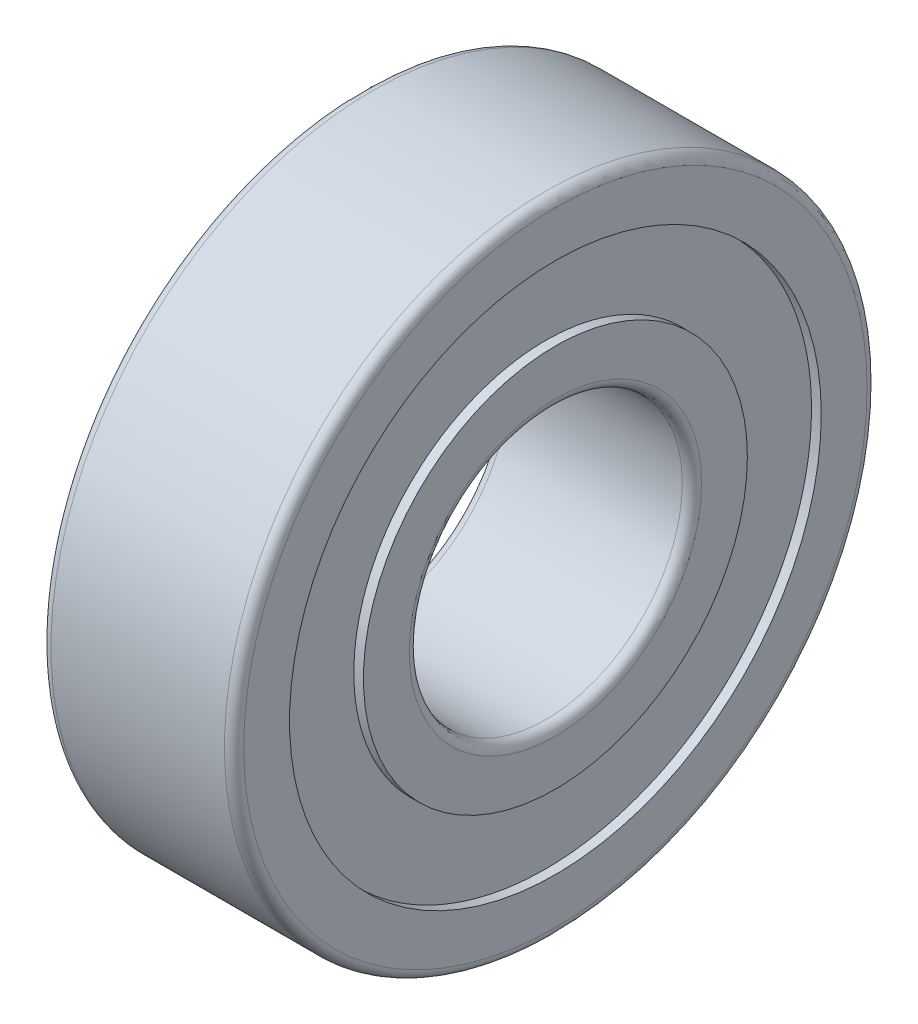
ISO-10303-21;
HEADER;
FILE_DESCRIPTION(('STEP AP214'),'2;1');
FILE_NAME('part.step','',(''),(''),'','','');
FILE_SCHEMA(('AUTOMOTIVE_DESIGN { 1 0 10303 214 1 1 1 1 }'));
ENDSEC;
DATA;
#1=APPLICATION_CONTEXT('core data for automotive mechanical design processes');
#2=APPLICATION_PROTOCOL_DEFINITION('international standard','automotive_design',2000,#1);
#3=PRODUCT_CONTEXT('',#1,'mechanical');
#4=PRODUCT('Part','Part','',(#3));
#5=PRODUCT_RELATED_PRODUCT_CATEGORY('part','',(#4));
#6=PRODUCT_DEFINITION_FORMATION('','',#4);
#7=PRODUCT_DEFINITION_CONTEXT('part definition',#1,'design');
#8=PRODUCT_DEFINITION('design','',#6,#7);
#9=PRODUCT_DEFINITION_SHAPE('','',#8);
#10=(LENGTH_UNIT() NAMED_UNIT(*) SI_UNIT(.MILLI.,.METRE.));
#11=(NAMED_UNIT(*) PLANE_ANGLE_UNIT() SI_UNIT($,.RADIAN.));
#12=(NAMED_UNIT(*) SI_UNIT($,.STERADIAN.) SOLID_ANGLE_UNIT());
#13=UNCERTAINTY_MEASURE_WITH_UNIT(LENGTH_MEASURE(1.E-05),#10,'distance_accuracy_value','');
#14=(GEOMETRIC_REPRESENTATION_CONTEXT(3) GLOBAL_UNCERTAINTY_ASSIGNED_CONTEXT((#13)) GLOBAL_UNIT_ASSIGNED_CONTEXT((#10,
#11,#12)) REPRESENTATION_CONTEXT('',''));
#15=CARTESIAN_POINT('',(0.,0.,0.));
#16=DIRECTION('',(0.,0.,1.));
#17=DIRECTION('',(1.,0.,0.));
#18=AXIS2_PLACEMENT_3D('',#15,#16,#17);
#19=CARTESIAN_POINT('',(-5.40000000000002,16.55,0.));
#20=DIRECTION('',(1.,0.,0.));
#21=DIRECTION('',(0.,0.,-1.));
#22=AXIS2_PLACEMENT_3D('',#19,#20,#21);
#23=PLANE('',#22);
#24=CARTESIAN_POINT('',(-5.40000000000002,0.,0.));
#25=DIRECTION('',(-1.,0.,0.));
#26=DIRECTION('',(0.,0.,1.));
#27=AXIS2_PLACEMENT_3D('',#24,#25,#26);
#28=CIRCLE('',#27,11.95);
#29=CARTESIAN_POINT('',(-5.40000000000002,0.,11.95));
#30=VERTEX_POINT('',#29);
#31=EDGE_CURVE('E55',#30,#30,#28,.T.);
#32=ORIENTED_EDGE('',*,*,#31,.F.);
#33=EDGE_LOOP('',(#32));
#34=FACE_BOUND('',#33,.T.);
#35=CARTESIAN_POINT('',(-5.40000000000002,0.,0.));
#36=DIRECTION('',(-1.,0.,0.));
#37=DIRECTION('',(0.,0.,1.));
#38=AXIS2_PLACEMENT_3D('',#35,#36,#37);
#39=CIRCLE('',#38,16.55);
#40=CARTESIAN_POINT('',(-5.40000000000002,0.,16.55));
#41=VERTEX_POINT('',#40);
#42=EDGE_CURVE('E11',#41,#41,#39,.T.);
#43=ORIENTED_EDGE('',*,*,#42,.T.);
#44=EDGE_LOOP('',(#43));
#45=FACE_BOUND('',#44,.T.);
#46=ADVANCED_FACE('F41',(#34,#45),#23,.F.);
#47=CARTESIAN_POINT('',(-20.6375,0.,0.));
#48=DIRECTION('',(-1.,0.,0.));
#49=DIRECTION('',(0.,0.,1.));
#50=AXIS2_PLACEMENT_3D('',#47,#48,#49);
#51=CYLINDRICAL_SURFACE('',#50,16.55);
#52=CARTESIAN_POINT('',(-4.8,0.,0.));
#53=DIRECTION('',(-1.,0.,0.));
#54=DIRECTION('',(0.,0.,1.));
#55=AXIS2_PLACEMENT_3D('',#52,#53,#54);
#56=CIRCLE('',#55,16.55);
#57=CARTESIAN_POINT('',(-4.8,0.,16.55));
#58=VERTEX_POINT('',#57);
#59=EDGE_CURVE('E47',#58,#58,#56,.T.);
#60=ORIENTED_EDGE('',*,*,#59,.T.);
#61=EDGE_LOOP('',(#60));
#62=FACE_BOUND('',#61,.T.);
#63=ORIENTED_EDGE('',*,*,#42,.F.);
#64=EDGE_LOOP('',(#63));
#65=FACE_BOUND('',#64,.T.);
#66=ADVANCED_FACE('F65',(#62,#65),#51,.T.);
#67=CARTESIAN_POINT('',(-4.8,16.55,0.));
#68=DIRECTION('',(1.,0.,0.));
#69=DIRECTION('',(0.,0.,-1.));
#70=AXIS2_PLACEMENT_3D('',#67,#68,#69);
#71=PLANE('',#70);
#72=CARTESIAN_POINT('',(-4.8,0.,0.));
#73=DIRECTION('',(-1.,0.,0.));
#74=DIRECTION('',(0.,0.,1.));
#75=AXIS2_PLACEMENT_3D('',#72,#73,#74);
#76=CIRCLE('',#75,11.95);
#77=CARTESIAN_POINT('',(-4.8,0.,11.95));
#78=VERTEX_POINT('',#77);
#79=EDGE_CURVE('E51',#78,#78,#76,.T.);
#80=ORIENTED_EDGE('',*,*,#79,.T.);
#81=EDGE_LOOP('',(#80));
#82=FACE_BOUND('',#81,.T.);
#83=ORIENTED_EDGE('',*,*,#59,.F.);
#84=EDGE_LOOP('',(#83));
#85=FACE_BOUND('',#84,.T.);
#86=ADVANCED_FACE('F69',(#82,#85),#71,.T.);
#87=CARTESIAN_POINT('',(-20.6375,0.,0.));
#88=DIRECTION('',(-1.,0.,0.));
#89=DIRECTION('',(0.,0.,1.));
#90=AXIS2_PLACEMENT_3D('',#87,#88,#89);
#91=CYLINDRICAL_SURFACE('',#90,11.95);
#92=ORIENTED_EDGE('',*,*,#31,.T.);
#93=EDGE_LOOP('',(#92));
#94=FACE_BOUND('',#93,.T.);
#95=ORIENTED_EDGE('',*,*,#79,.F.);
#96=EDGE_LOOP('',(#95));
#97=FACE_BOUND('',#96,.T.);
#98=ADVANCED_FACE('F61',(#94,#97),#91,.F.);
#99=CLOSED_SHELL('',(#46,#66,#86,#98));
#100=MANIFOLD_SOLID_BREP('B2',#99);
#101=CARTESIAN_POINT('',(4.8,16.55,0.));
#102=DIRECTION('',(1.,0.,0.));
#103=DIRECTION('',(0.,0.,-1.));
#104=AXIS2_PLACEMENT_3D('',#101,#102,#103);
#105=PLANE('',#104);
#106=CARTESIAN_POINT('',(4.8,0.,0.));
#107=DIRECTION('',(-1.,0.,0.));
#108=DIRECTION('',(0.,0.,1.));
#109=AXIS2_PLACEMENT_3D('',#106,#107,#108);
#110=CIRCLE('',#109,11.95);
#111=CARTESIAN_POINT('',(4.8,0.,11.95));
#112=VERTEX_POINT('',#111);
#113=EDGE_CURVE('E40',#112,#112,#110,.T.);
#114=ORIENTED_EDGE('',*,*,#113,.F.);
#115=EDGE_LOOP('',(#114));
#116=FACE_BOUND('',#115,.T.);
#117=CARTESIAN_POINT('',(4.8,0.,0.));
#118=DIRECTION('',(-1.,0.,0.));
#119=DIRECTION('',(0.,0.,1.));
#120=AXIS2_PLACEMENT_3D('',#117,#118,#119);
#121=CIRCLE('',#120,16.55);
#122=CARTESIAN_POINT('',(4.8,0.,16.55));
#123=VERTEX_POINT('',#122);
#124=EDGE_CURVE('E122',#123,#123,#121,.T.);
#125=ORIENTED_EDGE('',*,*,#124,.T.);
#126=EDGE_LOOP('',(#125));
#127=FACE_BOUND('',#126,.T.);
#128=ADVANCED_FACE('F108',(#116,#127),#105,.F.);
#129=CARTESIAN_POINT('',(-20.6375,0.,0.));
#130=DIRECTION('',(-1.,0.,0.));
#131=DIRECTION('',(0.,0.,1.));
#132=AXIS2_PLACEMENT_3D('',#129,#130,#131);
#133=CYLINDRICAL_SURFACE('',#132,11.95);
#134=ORIENTED_EDGE('',*,*,#113,.T.);
#135=EDGE_LOOP('',(#134));
#136=FACE_BOUND('',#135,.T.);
#137=CARTESIAN_POINT('',(5.40000000000002,0.,0.));
#138=DIRECTION('',(-1.,0.,0.));
#139=DIRECTION('',(0.,0.,1.));
#140=AXIS2_PLACEMENT_3D('',#137,#138,#139);
#141=CIRCLE('',#140,11.95);
#142=CARTESIAN_POINT('',(5.40000000000002,0.,11.95));
#143=VERTEX_POINT('',#142);
#144=EDGE_CURVE('E114',#143,#143,#141,.T.);
#145=ORIENTED_EDGE('',*,*,#144,.F.);
#146=EDGE_LOOP('',(#145));
#147=FACE_BOUND('',#146,.T.);
#148=ADVANCED_FACE('F137',(#136,#147),#133,.F.);
#149=CARTESIAN_POINT('',(5.40000000000002,16.55,0.));
#150=DIRECTION('',(1.,0.,0.));
#151=DIRECTION('',(0.,0.,-1.));
#152=AXIS2_PLACEMENT_3D('',#149,#150,#151);
#153=PLANE('',#152);
#154=ORIENTED_EDGE('',*,*,#144,.T.);
#155=EDGE_LOOP('',(#154));
#156=FACE_BOUND('',#155,.T.);
#157=CARTESIAN_POINT('',(5.40000000000002,0.,0.));
#158=DIRECTION('',(-1.,0.,0.));
#159=DIRECTION('',(0.,0.,1.));
#160=AXIS2_PLACEMENT_3D('',#157,#158,#159);
#161=CIRCLE('',#160,16.55);
#162=CARTESIAN_POINT('',(5.40000000000002,0.,16.55));
#163=VERTEX_POINT('',#162);
#164=EDGE_CURVE('E118',#163,#163,#161,.T.);
#165=ORIENTED_EDGE('',*,*,#164,.F.);
#166=EDGE_LOOP('',(#165));
#167=FACE_BOUND('',#166,.T.);
#168=ADVANCED_FACE('F131',(#156,#167),#153,.T.);
#169=CARTESIAN_POINT('',(-20.6375,0.,0.));
#170=DIRECTION('',(-1.,0.,0.));
#171=DIRECTION('',(0.,0.,1.));
#172=AXIS2_PLACEMENT_3D('',#169,#170,#171);
#173=CYLINDRICAL_SURFACE('',#172,16.55);
#174=ORIENTED_EDGE('',*,*,#164,.T.);
#175=EDGE_LOOP('',(#174));
#176=FACE_BOUND('',#175,.T.);
#177=ORIENTED_EDGE('',*,*,#124,.F.);
#178=EDGE_LOOP('',(#177));
#179=FACE_BOUND('',#178,.T.);
#180=ADVANCED_FACE('F129',(#176,#179),#173,.T.);
#181=CLOSED_SHELL('',(#128,#148,#168,#180));
#182=MANIFOLD_SOLID_BREP('B6',#181);
#183=CARTESIAN_POINT('',(0.,11.5284921698431,8.3759398451676));
#184=DIRECTION('',(1.,0.,0.));
#185=DIRECTION('',(0.,-0.809016994374956,-0.587785252292464));
#186=AXIS2_PLACEMENT_3D('',#183,#184,#185);
#187=SPHERICAL_SURFACE('',#186,3.45);
#188=CARTESIAN_POINT('',(3.45,11.5284921698431,8.3759398451676));
#189=VERTEX_POINT('',#188);
#190=VERTEX_LOOP('',#189);
#191=FACE_BOUND('',#190,.T.);
#192=ADVANCED_FACE('F175',(#191),#187,.T.);
#193=CLOSED_SHELL('',(#192));
#194=MANIFOLD_SOLID_BREP('B35',#193);
#195=CARTESIAN_POINT('',(0.,4.40349216984316,13.5525553572059));
#196=DIRECTION('',(1.,0.,0.));
#197=DIRECTION('',(0.,-0.309016994374959,-0.951056516295151));
#198=AXIS2_PLACEMENT_3D('',#195,#196,#197);
#199=SPHERICAL_SURFACE('',#198,3.45);
#200=CARTESIAN_POINT('',(3.45,4.40349216984316,13.5525553572059));
#201=VERTEX_POINT('',#200);
#202=VERTEX_LOOP('',#201);
#203=FACE_BOUND('',#202,.T.);
#204=ADVANCED_FACE('F193',(#203),#199,.T.);
#205=CLOSED_SHELL('',(#204));
#206=MANIFOLD_SOLID_BREP('B104',#205);
#207=CARTESIAN_POINT('',(0.,-4.40349216984287,13.552555357206));
#208=DIRECTION('',(1.,0.,0.));
#209=DIRECTION('',(0.,0.309016994374938,-0.951056516295158));
#210=AXIS2_PLACEMENT_3D('',#207,#208,#209);
#211=SPHERICAL_SURFACE('',#210,3.45);
#212=CARTESIAN_POINT('',(3.45,-4.40349216984287,13.552555357206));
#213=VERTEX_POINT('',#212);
#214=VERTEX_LOOP('',#213);
#215=FACE_BOUND('',#214,.T.);
#216=ADVANCED_FACE('F211',(#215),#211,.T.);
#217=CLOSED_SHELL('',(#216));
#218=MANIFOLD_SOLID_BREP('B171',#217);
#219=CARTESIAN_POINT('',(0.,-11.5284921698429,8.37593984516786));
#220=DIRECTION('',(1.,0.,0.));
#221=DIRECTION('',(0.,0.809016994374943,-0.587785252292481));
#222=AXIS2_PLACEMENT_3D('',#219,#220,#221);
#223=SPHERICAL_SURFACE('',#222,3.45);
#224=CARTESIAN_POINT('',(3.45,-11.5284921698429,8.37593984516786));
#225=VERTEX_POINT('',#224);
#226=VERTEX_LOOP('',#225);
#227=FACE_BOUND('',#226,.T.);
#228=ADVANCED_FACE('F229',(#227),#223,.T.);
#229=CLOSED_SHELL('',(#228));
#230=MANIFOLD_SOLID_BREP('B189',#229);
#231=CARTESIAN_POINT('',(0.,-14.25,0.));
#232=DIRECTION('',(1.,0.,0.));
#233=DIRECTION('',(0.,1.,0.));
#234=AXIS2_PLACEMENT_3D('',#231,#232,#233);
#235=SPHERICAL_SURFACE('',#234,3.45);
#236=CARTESIAN_POINT('',(3.45,-14.25,0.));
#237=VERTEX_POINT('',#236);
#238=VERTEX_LOOP('',#237);
#239=FACE_BOUND('',#238,.T.);
#240=ADVANCED_FACE('F247',(#239),#235,.T.);
#241=CLOSED_SHELL('',(#240));
#242=MANIFOLD_SOLID_BREP('B207',#241);
#243=CARTESIAN_POINT('',(0.,-11.5284921698431,-8.3759398451677));
#244=DIRECTION('',(1.,0.,0.));
#245=DIRECTION('',(0.,0.809016994374951,0.58778525229247));
#246=AXIS2_PLACEMENT_3D('',#243,#244,#245);
#247=SPHERICAL_SURFACE('',#246,3.45);
#248=CARTESIAN_POINT('',(3.45,-11.5284921698431,-8.3759398451677));
#249=VERTEX_POINT('',#248);
#250=VERTEX_LOOP('',#249);
#251=FACE_BOUND('',#250,.T.);
#252=ADVANCED_FACE('F265',(#251),#247,.T.);
#253=CLOSED_SHELL('',(#252));
#254=MANIFOLD_SOLID_BREP('B225',#253);
#255=CARTESIAN_POINT('',(0.,-4.40349216984308,-13.5525553572059));
#256=DIRECTION('',(1.,0.,0.));
#257=DIRECTION('',(0.,0.309016994374952,0.951056516295154));
#258=AXIS2_PLACEMENT_3D('',#255,#256,#257);
#259=SPHERICAL_SURFACE('',#258,3.45);
#260=CARTESIAN_POINT('',(3.45,-4.40349216984308,-13.5525553572059));
#261=VERTEX_POINT('',#260);
#262=VERTEX_LOOP('',#261);
#263=FACE_BOUND('',#262,.T.);
#264=ADVANCED_FACE('F283',(#263),#259,.T.);
#265=CLOSED_SHELL('',(#264));
#266=MANIFOLD_SOLID_BREP('B243',#265);
#267=CARTESIAN_POINT('',(0.,4.40349216984296,-13.552555357206));
#268=DIRECTION('',(1.,0.,0.));
#269=DIRECTION('',(0.,-0.309016994374945,0.951056516295156));
#270=AXIS2_PLACEMENT_3D('',#267,#268,#269);
#271=SPHERICAL_SURFACE('',#270,3.45);
#272=CARTESIAN_POINT('',(3.45,4.40349216984296,-13.552555357206));
#273=VERTEX_POINT('',#272);
#274=VERTEX_LOOP('',#273);
#275=FACE_BOUND('',#274,.T.);
#276=ADVANCED_FACE('F301',(#275),#271,.T.);
#277=CLOSED_SHELL('',(#276));
#278=MANIFOLD_SOLID_BREP('B261',#277);
#279=CARTESIAN_POINT('',(0.,11.528492169843,-8.37593984516776));
#280=DIRECTION('',(1.,0.,0.));
#281=DIRECTION('',(0.,-0.809016994374947,0.587785252292475));
#282=AXIS2_PLACEMENT_3D('',#279,#280,#281);
#283=SPHERICAL_SURFACE('',#282,3.45);
#284=CARTESIAN_POINT('',(3.45,11.528492169843,-8.37593984516776));
#285=VERTEX_POINT('',#284);
#286=VERTEX_LOOP('',#285);
#287=FACE_BOUND('',#286,.T.);
#288=ADVANCED_FACE('F321',(#287),#283,.T.);
#289=CLOSED_SHELL('',(#288));
#290=MANIFOLD_SOLID_BREP('B279',#289);
#291=CARTESIAN_POINT('',(0.,0.,0.));
#292=DIRECTION('',(1.,0.,0.));
#293=DIRECTION('',(0.,0.,-1.));
#294=AXIS2_PLACEMENT_3D('',#291,#292,#293);
#295=TOROIDAL_SURFACE('',#294,14.25,3.425);
#296=CARTESIAN_POINT('',(2.5378386473533,0.,0.));
#297=DIRECTION('',(1.,0.,0.));
#298=DIRECTION('',(0.,0.,-1.));
#299=AXIS2_PLACEMENT_3D('',#296,#297,#298);
#300=CIRCLE('',#299,16.55);
#301=CARTESIAN_POINT('',(2.5378386473533,0.,-16.55));
#302=VERTEX_POINT('',#301);
#303=EDGE_CURVE('E320',#302,#302,#300,.T.);
#304=ORIENTED_EDGE('',*,*,#303,.T.);
#305=EDGE_LOOP('',(#304));
#306=FACE_BOUND('',#305,.T.);
#307=CARTESIAN_POINT('',(-2.5378386473533,0.,0.));
#308=DIRECTION('',(1.,0.,0.));
#309=DIRECTION('',(0.,0.,-1.));
#310=AXIS2_PLACEMENT_3D('',#307,#308,#309);
#311=CIRCLE('',#310,16.55);
#312=CARTESIAN_POINT('',(-2.5378386473533,0.,-16.55));
#313=VERTEX_POINT('',#312);
#314=EDGE_CURVE('E369',#313,#313,#311,.T.);
#315=ORIENTED_EDGE('',*,*,#314,.F.);
#316=EDGE_LOOP('',(#315));
#317=FACE_BOUND('',#316,.T.);
#318=ADVANCED_FACE('F341',(#306,#317),#295,.F.);
#319=CARTESIAN_POINT('',(-20.6375,0.,0.));
#320=DIRECTION('',(1.,0.,0.));
#321=DIRECTION('',(0.,0.,-1.));
#322=AXIS2_PLACEMENT_3D('',#319,#320,#321);
#323=CYLINDRICAL_SURFACE('',#322,16.55);
#324=CARTESIAN_POINT('',(6.00000000000001,0.,0.));
#325=DIRECTION('',(1.,0.,0.));
#326=DIRECTION('',(0.,0.,-1.));
#327=AXIS2_PLACEMENT_3D('',#324,#325,#326);
#328=CIRCLE('',#327,16.55);
#329=CARTESIAN_POINT('',(6.00000000000001,0.,-16.55));
#330=VERTEX_POINT('',#329);
#331=EDGE_CURVE('E347',#330,#330,#328,.T.);
#332=ORIENTED_EDGE('',*,*,#331,.T.);
#333=EDGE_LOOP('',(#332));
#334=FACE_BOUND('',#333,.T.);
#335=ORIENTED_EDGE('',*,*,#303,.F.);
#336=EDGE_LOOP('',(#335));
#337=FACE_BOUND('',#336,.T.);
#338=ADVANCED_FACE('F377',(#334,#337),#323,.F.);
#339=CARTESIAN_POINT('',(6.00000000000001,19.4,0.));
#340=DIRECTION('',(1.,0.,0.));
#341=DIRECTION('',(0.,0.,-1.));
#342=AXIS2_PLACEMENT_3D('',#339,#340,#341);
#343=PLANE('',#342);
#344=CARTESIAN_POINT('',(6.00000000000001,0.,0.));
#345=DIRECTION('',(1.,0.,0.));
#346=DIRECTION('',(0.,0.,-1.));
#347=AXIS2_PLACEMENT_3D('',#344,#345,#346);
#348=CIRCLE('',#347,19.4);
#349=CARTESIAN_POINT('',(6.00000000000001,0.,-19.4));
#350=VERTEX_POINT('',#349);
#351=EDGE_CURVE('E351',#350,#350,#348,.T.);
#352=ORIENTED_EDGE('',*,*,#351,.T.);
#353=EDGE_LOOP('',(#352));
#354=FACE_BOUND('',#353,.T.);
#355=ORIENTED_EDGE('',*,*,#331,.F.);
#356=EDGE_LOOP('',(#355));
#357=FACE_BOUND('',#356,.T.);
#358=ADVANCED_FACE('F381',(#354,#357),#343,.T.);
#359=CARTESIAN_POINT('',(5.40000000000002,0.,0.));
#360=DIRECTION('',(1.,0.,0.));
#361=DIRECTION('',(0.,0.,-1.));
#362=AXIS2_PLACEMENT_3D('',#359,#360,#361);
#363=TOROIDAL_SURFACE('',#362,19.4,0.599999999999998);
#364=CARTESIAN_POINT('',(5.40000000000002,0.,0.));
#365=DIRECTION('',(1.,0.,0.));
#366=DIRECTION('',(0.,0.,-1.));
#367=AXIS2_PLACEMENT_3D('',#364,#365,#366);
#368=CIRCLE('',#367,20.);
#369=CARTESIAN_POINT('',(5.40000000000002,0.,-20.));
#370=VERTEX_POINT('',#369);
#371=EDGE_CURVE('E355',#370,#370,#368,.T.);
#372=ORIENTED_EDGE('',*,*,#371,.T.);
#373=EDGE_LOOP('',(#372));
#374=FACE_BOUND('',#373,.T.);
#375=ORIENTED_EDGE('',*,*,#351,.F.);
#376=EDGE_LOOP('',(#375));
#377=FACE_BOUND('',#376,.T.);
#378=ADVANCED_FACE('F385',(#374,#377),#363,.T.);
#379=CARTESIAN_POINT('',(-20.6375,0.,0.));
#380=DIRECTION('',(1.,0.,0.));
#381=DIRECTION('',(0.,0.,-1.));
#382=AXIS2_PLACEMENT_3D('',#379,#380,#381);
#383=CYLINDRICAL_SURFACE('',#382,20.);
#384=CARTESIAN_POINT('',(-5.40000000000002,0.,0.));
#385=DIRECTION('',(1.,0.,0.));
#386=DIRECTION('',(0.,0.,-1.));
#387=AXIS2_PLACEMENT_3D('',#384,#385,#386);
#388=CIRCLE('',#387,20.);
#389=CARTESIAN_POINT('',(-5.40000000000002,0.,-20.));
#390=VERTEX_POINT('',#389);
#391=EDGE_CURVE('E360',#390,#390,#388,.T.);
#392=ORIENTED_EDGE('',*,*,#391,.T.);
#393=EDGE_LOOP('',(#392));
#394=FACE_BOUND('',#393,.T.);
#395=ORIENTED_EDGE('',*,*,#371,.F.);
#396=EDGE_LOOP('',(#395));
#397=FACE_BOUND('',#396,.T.);
#398=ADVANCED_FACE('F392',(#394,#397),#383,.T.);
#399=CARTESIAN_POINT('',(-5.40000000000002,0.,0.));
#400=DIRECTION('',(1.,0.,0.));
#401=DIRECTION('',(0.,0.,-1.));
#402=AXIS2_PLACEMENT_3D('',#399,#400,#401);
#403=TOROIDAL_SURFACE('',#402,19.4,0.599999999999998);
#404=CARTESIAN_POINT('',(-6.00000000000001,0.,0.));
#405=DIRECTION('',(1.,0.,0.));
#406=DIRECTION('',(0.,0.,-1.));
#407=AXIS2_PLACEMENT_3D('',#404,#405,#406);
#408=CIRCLE('',#407,19.4);
#409=CARTESIAN_POINT('',(-6.00000000000001,0.,-19.4));
#410=VERTEX_POINT('',#409);
#411=EDGE_CURVE('E363',#410,#410,#408,.T.);
#412=ORIENTED_EDGE('',*,*,#411,.T.);
#413=EDGE_LOOP('',(#412));
#414=FACE_BOUND('',#413,.T.);
#415=ORIENTED_EDGE('',*,*,#391,.F.);
#416=EDGE_LOOP('',(#415));
#417=FACE_BOUND('',#416,.T.);
#418=ADVANCED_FACE('F396',(#414,#417),#403,.T.);
#419=CARTESIAN_POINT('',(-6.00000000000001,16.55,0.));
#420=DIRECTION('',(-1.,0.,0.));
#421=DIRECTION('',(0.,0.,1.));
#422=AXIS2_PLACEMENT_3D('',#419,#420,#421);
#423=PLANE('',#422);
#424=CARTESIAN_POINT('',(-6.00000000000001,0.,0.));
#425=DIRECTION('',(1.,0.,0.));
#426=DIRECTION('',(0.,0.,-1.));
#427=AXIS2_PLACEMENT_3D('',#424,#425,#426);
#428=CIRCLE('',#427,16.55);
#429=CARTESIAN_POINT('',(-6.00000000000001,0.,-16.55));
#430=VERTEX_POINT('',#429);
#431=EDGE_CURVE('E366',#430,#430,#428,.T.);
#432=ORIENTED_EDGE('',*,*,#431,.T.);
#433=EDGE_LOOP('',(#432));
#434=FACE_BOUND('',#433,.T.);
#435=ORIENTED_EDGE('',*,*,#411,.F.);
#436=EDGE_LOOP('',(#435));
#437=FACE_BOUND('',#436,.T.);
#438=ADVANCED_FACE('F400',(#434,#437),#423,.T.);
#439=CARTESIAN_POINT('',(-20.6375,0.,0.));
#440=DIRECTION('',(1.,0.,0.));
#441=DIRECTION('',(0.,0.,-1.));
#442=AXIS2_PLACEMENT_3D('',#439,#440,#441);
#443=CYLINDRICAL_SURFACE('',#442,16.55);
#444=ORIENTED_EDGE('',*,*,#314,.T.);
#445=EDGE_LOOP('',(#444));
#446=FACE_BOUND('',#445,.T.);
#447=ORIENTED_EDGE('',*,*,#431,.F.);
#448=EDGE_LOOP('',(#447));
#449=FACE_BOUND('',#448,.T.);
#450=ADVANCED_FACE('F373',(#446,#449),#443,.F.);
#451=CLOSED_SHELL('',(#318,#338,#358,#378,#398,#418,#438,#450));
#452=MANIFOLD_SOLID_BREP('B297',#451);
#453=CARTESIAN_POINT('',(0.,0.,0.));
#454=DIRECTION('',(1.,0.,0.));
#455=DIRECTION('',(0.,0.,-1.));
#456=AXIS2_PLACEMENT_3D('',#453,#454,#455);
#457=TOROIDAL_SURFACE('',#456,14.25,3.425);
#458=CARTESIAN_POINT('',(-2.5378386473533,0.,0.));
#459=DIRECTION('',(1.,0.,0.));
#460=DIRECTION('',(0.,0.,-1.));
#461=AXIS2_PLACEMENT_3D('',#458,#459,#460);
#462=CIRCLE('',#461,11.95);
#463=CARTESIAN_POINT('',(-2.5378386473533,0.,-11.95));
#464=VERTEX_POINT('',#463);
#465=EDGE_CURVE('E495',#464,#464,#462,.T.);
#466=ORIENTED_EDGE('',*,*,#465,.T.);
#467=EDGE_LOOP('',(#466));
#468=FACE_BOUND('',#467,.T.);
#469=CARTESIAN_POINT('',(2.5378386473533,0.,0.));
#470=DIRECTION('',(1.,0.,0.));
#471=DIRECTION('',(0.,0.,-1.));
#472=AXIS2_PLACEMENT_3D('',#469,#470,#471);
#473=CIRCLE('',#472,11.95);
#474=CARTESIAN_POINT('',(2.5378386473533,0.,-11.95));
#475=VERTEX_POINT('',#474);
#476=EDGE_CURVE('E340',#475,#475,#473,.T.);
#477=ORIENTED_EDGE('',*,*,#476,.F.);
#478=EDGE_LOOP('',(#477));
#479=FACE_BOUND('',#478,.T.);
#480=ADVANCED_FACE('F467',(#468,#479),#457,.F.);
#481=CARTESIAN_POINT('',(-20.6375,0.,0.));
#482=DIRECTION('',(1.,0.,0.));
#483=DIRECTION('',(0.,0.,-1.));
#484=AXIS2_PLACEMENT_3D('',#481,#482,#483);
#485=CYLINDRICAL_SURFACE('',#484,11.95);
#486=ORIENTED_EDGE('',*,*,#476,.T.);
#487=EDGE_LOOP('',(#486));
#488=FACE_BOUND('',#487,.T.);
#489=CARTESIAN_POINT('',(6.00000000000001,0.,0.));
#490=DIRECTION('',(1.,0.,0.));
#491=DIRECTION('',(0.,0.,-1.));
#492=AXIS2_PLACEMENT_3D('',#489,#490,#491);
#493=CIRCLE('',#492,11.95);
#494=CARTESIAN_POINT('',(6.00000000000001,0.,-11.95));
#495=VERTEX_POINT('',#494);
#496=EDGE_CURVE('E473',#495,#495,#493,.T.);
#497=ORIENTED_EDGE('',*,*,#496,.F.);
#498=EDGE_LOOP('',(#497));
#499=FACE_BOUND('',#498,.T.);
#500=ADVANCED_FACE('F513',(#488,#499),#485,.T.);
#501=CARTESIAN_POINT('',(6.00000000000001,9.1,0.));
#502=DIRECTION('',(1.,0.,0.));
#503=DIRECTION('',(0.,0.,-1.));
#504=AXIS2_PLACEMENT_3D('',#501,#502,#503);
#505=PLANE('',#504);
#506=ORIENTED_EDGE('',*,*,#496,.T.);
#507=EDGE_LOOP('',(#506));
#508=FACE_BOUND('',#507,.T.);
#509=CARTESIAN_POINT('',(6.00000000000001,0.,0.));
#510=DIRECTION('',(1.,0.,0.));
#511=DIRECTION('',(0.,0.,-1.));
#512=AXIS2_PLACEMENT_3D('',#509,#510,#511);
#513=CIRCLE('',#512,9.1);
#514=CARTESIAN_POINT('',(6.00000000000001,0.,-9.10000000000001));
#515=VERTEX_POINT('',#514);
#516=EDGE_CURVE('E477',#515,#515,#513,.T.);
#517=ORIENTED_EDGE('',*,*,#516,.F.);
#518=EDGE_LOOP('',(#517));
#519=FACE_BOUND('',#518,.T.);
#520=ADVANCED_FACE('F517',(#508,#519),#505,.T.);
#521=CARTESIAN_POINT('',(5.40000000000002,0.,0.));
#522=DIRECTION('',(1.,0.,0.));
#523=DIRECTION('',(0.,0.,-1.));
#524=AXIS2_PLACEMENT_3D('',#521,#522,#523);
#525=TOROIDAL_SURFACE('',#524,9.1,0.6);
#526=ORIENTED_EDGE('',*,*,#516,.T.);
#527=EDGE_LOOP('',(#526));
#528=FACE_BOUND('',#527,.T.);
#529=CARTESIAN_POINT('',(5.40000000000002,0.,0.));
#530=DIRECTION('',(1.,0.,0.));
#531=DIRECTION('',(0.,0.,-1.));
#532=AXIS2_PLACEMENT_3D('',#529,#530,#531);
#533=CIRCLE('',#532,8.5);
#534=CARTESIAN_POINT('',(5.40000000000002,0.,-8.50000000000001));
#535=VERTEX_POINT('',#534);
#536=EDGE_CURVE('E481',#535,#535,#533,.T.);
#537=ORIENTED_EDGE('',*,*,#536,.F.);
#538=EDGE_LOOP('',(#537));
#539=FACE_BOUND('',#538,.T.);
#540=ADVANCED_FACE('F521',(#528,#539),#525,.T.);
#541=CARTESIAN_POINT('',(-20.6375,0.,0.));
#542=DIRECTION('',(1.,0.,0.));
#543=DIRECTION('',(0.,0.,-1.));
#544=AXIS2_PLACEMENT_3D('',#541,#542,#543);
#545=CYLINDRICAL_SURFACE('',#544,8.5);
#546=ORIENTED_EDGE('',*,*,#536,.T.);
#547=EDGE_LOOP('',(#546));
#548=FACE_BOUND('',#547,.T.);
#549=CARTESIAN_POINT('',(-5.40000000000002,0.,0.));
#550=DIRECTION('',(1.,0.,0.));
#551=DIRECTION('',(0.,0.,-1.));
#552=AXIS2_PLACEMENT_3D('',#549,#550,#551);
#553=CIRCLE('',#552,8.5);
#554=CARTESIAN_POINT('',(-5.40000000000002,0.,-8.50000000000001));
#555=VERTEX_POINT('',#554);
#556=EDGE_CURVE('E486',#555,#555,#553,.T.);
#557=ORIENTED_EDGE('',*,*,#556,.F.);
#558=EDGE_LOOP('',(#557));
#559=FACE_BOUND('',#558,.T.);
#560=ADVANCED_FACE('F527',(#548,#559),#545,.F.);
#561=CARTESIAN_POINT('',(-5.40000000000002,0.,0.));
#562=DIRECTION('',(1.,0.,0.));
#563=DIRECTION('',(0.,0.,-1.));
#564=AXIS2_PLACEMENT_3D('',#561,#562,#563);
#565=TOROIDAL_SURFACE('',#564,9.1,0.6);
#566=ORIENTED_EDGE('',*,*,#556,.T.);
#567=EDGE_LOOP('',(#566));
#568=FACE_BOUND('',#567,.T.);
#569=CARTESIAN_POINT('',(-6.00000000000001,0.,0.));
#570=DIRECTION('',(1.,0.,0.));
#571=DIRECTION('',(0.,0.,-1.));
#572=AXIS2_PLACEMENT_3D('',#569,#570,#571);
#573=CIRCLE('',#572,9.1);
#574=CARTESIAN_POINT('',(-6.00000000000001,0.,-9.10000000000001));
#575=VERTEX_POINT('',#574);
#576=EDGE_CURVE('E489',#575,#575,#573,.T.);
#577=ORIENTED_EDGE('',*,*,#576,.F.);
#578=EDGE_LOOP('',(#577));
#579=FACE_BOUND('',#578,.T.);
#580=ADVANCED_FACE('F509',(#568,#579),#565,.T.);
#581=CARTESIAN_POINT('',(-6.00000000000001,11.95,0.));
#582=DIRECTION('',(-1.,0.,0.));
#583=DIRECTION('',(0.,0.,1.));
#584=AXIS2_PLACEMENT_3D('',#581,#582,#583);
#585=PLANE('',#584);
#586=ORIENTED_EDGE('',*,*,#576,.T.);
#587=EDGE_LOOP('',(#586));
#588=FACE_BOUND('',#587,.T.);
#589=CARTESIAN_POINT('',(-6.00000000000001,0.,0.));
#590=DIRECTION('',(1.,0.,0.));
#591=DIRECTION('',(0.,0.,-1.));
#592=AXIS2_PLACEMENT_3D('',#589,#590,#591);
#593=CIRCLE('',#592,11.95);
#594=CARTESIAN_POINT('',(-6.00000000000001,0.,-11.95));
#595=VERTEX_POINT('',#594);
#596=EDGE_CURVE('E492',#595,#595,#593,.T.);
#597=ORIENTED_EDGE('',*,*,#596,.F.);
#598=EDGE_LOOP('',(#597));
#599=FACE_BOUND('',#598,.T.);
#600=ADVANCED_FACE('F503',(#588,#599),#585,.T.);
#601=CARTESIAN_POINT('',(-20.6375,0.,0.));
#602=DIRECTION('',(1.,0.,0.));
#603=DIRECTION('',(0.,0.,-1.));
#604=AXIS2_PLACEMENT_3D('',#601,#602,#603);
#605=CYLINDRICAL_SURFACE('',#604,11.95);
#606=ORIENTED_EDGE('',*,*,#596,.T.);
#607=EDGE_LOOP('',(#606));
#608=FACE_BOUND('',#607,.T.);
#609=ORIENTED_EDGE('',*,*,#465,.F.);
#610=EDGE_LOOP('',(#609));
#611=FACE_BOUND('',#610,.T.);
#612=ADVANCED_FACE('F501',(#608,#611),#605,.T.);
#613=CLOSED_SHELL('',(#480,#500,#520,#540,#560,#580,#600,#612));
#614=MANIFOLD_SOLID_BREP('B315',#613);
#615=CARTESIAN_POINT('',(0.,14.25,0.));
#616=DIRECTION('',(1.,0.,0.));
#617=DIRECTION('',(0.,-1.,0.));
#618=AXIS2_PLACEMENT_3D('',#615,#616,#617);
#619=SPHERICAL_SURFACE('',#618,3.45);
#620=CARTESIAN_POINT('',(3.45,14.25,0.));
#621=VERTEX_POINT('',#620);
#622=VERTEX_LOOP('',#621);
#623=FACE_BOUND('',#622,.T.);
#624=ADVANCED_FACE('F588',(#623),#619,.T.);
#625=CLOSED_SHELL('',(#624));
#626=MANIFOLD_SOLID_BREP('B335',#625);
#627=ADVANCED_BREP_SHAPE_REPRESENTATION('',(#18,#100,#182,#194,#206,#218,#230,#242,#254,#266,
#278,#290,#452,#614,#626),#14);
#628=SHAPE_DEFINITION_REPRESENTATION(#9,#627);
ENDSEC;
END-ISO-10303-21;
